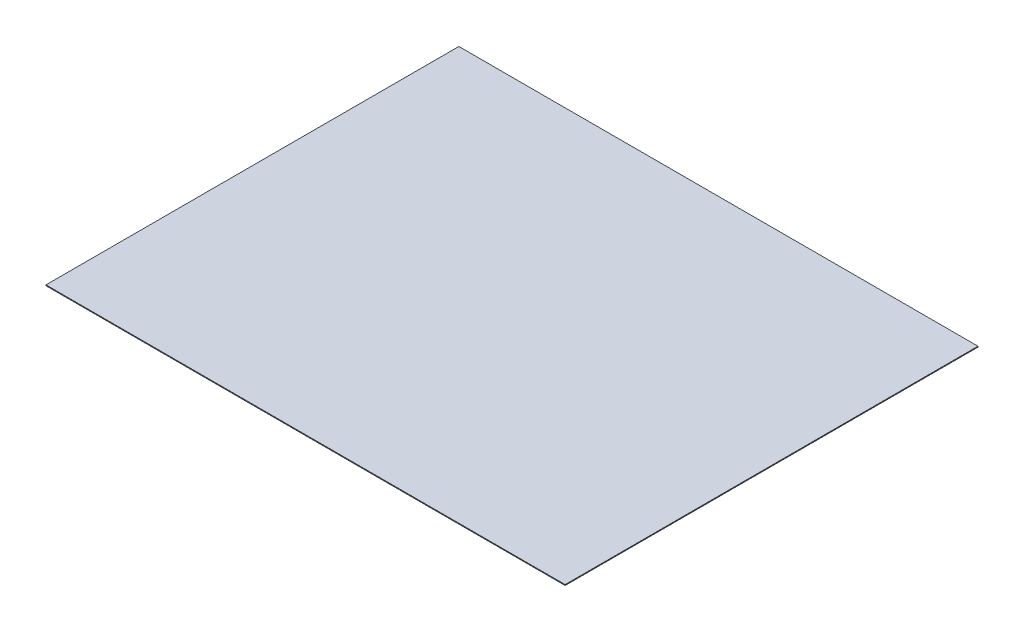
ISO-10303-21;
HEADER;
FILE_DESCRIPTION(('STEP AP214'),'2;1');
FILE_NAME('part.step','',(''),(''),'','','');
FILE_SCHEMA(('AUTOMOTIVE_DESIGN { 1 0 10303 214 1 1 1 1 }'));
ENDSEC;
DATA;
#1=APPLICATION_CONTEXT('core data for automotive mechanical design processes');
#2=APPLICATION_PROTOCOL_DEFINITION('international standard','automotive_design',2000,#1);
#3=PRODUCT_CONTEXT('',#1,'mechanical');
#4=PRODUCT('Part','Part','',(#3));
#5=PRODUCT_RELATED_PRODUCT_CATEGORY('part','',(#4));
#6=PRODUCT_DEFINITION_FORMATION('','',#4);
#7=PRODUCT_DEFINITION_CONTEXT('part definition',#1,'design');
#8=PRODUCT_DEFINITION('design','',#6,#7);
#9=PRODUCT_DEFINITION_SHAPE('','',#8);
#10=(LENGTH_UNIT() NAMED_UNIT(*) SI_UNIT(.MILLI.,.METRE.));
#11=(NAMED_UNIT(*) PLANE_ANGLE_UNIT() SI_UNIT($,.RADIAN.));
#12=(NAMED_UNIT(*) SI_UNIT($,.STERADIAN.) SOLID_ANGLE_UNIT());
#13=UNCERTAINTY_MEASURE_WITH_UNIT(LENGTH_MEASURE(1.E-05),#10,'distance_accuracy_value','');
#14=(GEOMETRIC_REPRESENTATION_CONTEXT(3) GLOBAL_UNCERTAINTY_ASSIGNED_CONTEXT((#13)) GLOBAL_UNIT_ASSIGNED_CONTEXT((#10,
#11,#12)) REPRESENTATION_CONTEXT('',''));
#15=CARTESIAN_POINT('',(0.,0.,0.));
#16=DIRECTION('',(0.,0.,1.));
#17=DIRECTION('',(1.,0.,0.));
#18=AXIS2_PLACEMENT_3D('',#15,#16,#17);
#19=CARTESIAN_POINT('',(0.,0.2,0.));
#20=DIRECTION('',(1.,0.,0.));
#21=DIRECTION('',(0.,0.,-1.));
#22=AXIS2_PLACEMENT_3D('',#19,#20,#21);
#23=PLANE('',#22);
#24=DIRECTION('',(0.,0.,1.));
#25=VECTOR('',#24,1.);
#26=CARTESIAN_POINT('',(0.,0.,0.));
#27=LINE('',#26,#25);
#28=CARTESIAN_POINT('',(0.,0.,0.));
#29=VERTEX_POINT('',#28);
#30=CARTESIAN_POINT('',(0.,0.,101.));
#31=VERTEX_POINT('',#30);
#32=EDGE_CURVE('E101',#29,#31,#27,.T.);
#33=ORIENTED_EDGE('',*,*,#32,.T.);
#34=DIRECTION('',(0.,-1.,0.));
#35=VECTOR('',#34,1.);
#36=CARTESIAN_POINT('',(0.,0.2,101.));
#37=LINE('',#36,#35);
#38=CARTESIAN_POINT('',(0.,0.2,101.));
#39=VERTEX_POINT('',#38);
#40=EDGE_CURVE('E11',#39,#31,#37,.T.);
#41=ORIENTED_EDGE('',*,*,#40,.F.);
#42=DIRECTION('',(0.,0.,1.));
#43=VECTOR('',#42,1.);
#44=CARTESIAN_POINT('',(0.,0.2,0.));
#45=LINE('',#44,#43);
#46=CARTESIAN_POINT('',(0.,0.2,0.));
#47=VERTEX_POINT('',#46);
#48=EDGE_CURVE('E89',#47,#39,#45,.T.);
#49=ORIENTED_EDGE('',*,*,#48,.F.);
#50=DIRECTION('',(0.,-1.,0.));
#51=VECTOR('',#50,1.);
#52=CARTESIAN_POINT('',(0.,0.2,0.));
#53=LINE('',#52,#51);
#54=EDGE_CURVE('E97',#47,#29,#53,.T.);
#55=ORIENTED_EDGE('',*,*,#54,.T.);
#56=EDGE_LOOP('',(#33,#41,#49,#55));
#57=FACE_BOUND('',#56,.T.);
#58=ADVANCED_FACE('F38',(#57),#23,.F.);
#59=CARTESIAN_POINT('',(0.,0.2,101.));
#60=DIRECTION('',(0.,0.,-1.));
#61=DIRECTION('',(-1.,0.,0.));
#62=AXIS2_PLACEMENT_3D('',#59,#60,#61);
#63=PLANE('',#62);
#64=DIRECTION('',(1.,0.,0.));
#65=VECTOR('',#64,1.);
#66=CARTESIAN_POINT('',(0.,0.,101.));
#67=LINE('',#66,#65);
#68=CARTESIAN_POINT('',(127.,0.,101.));
#69=VERTEX_POINT('',#68);
#70=EDGE_CURVE('E93',#31,#69,#67,.T.);
#71=ORIENTED_EDGE('',*,*,#70,.T.);
#72=DIRECTION('',(0.,-1.,0.));
#73=VECTOR('',#72,1.);
#74=CARTESIAN_POINT('',(127.,0.2,101.));
#75=LINE('',#74,#73);
#76=CARTESIAN_POINT('',(127.,0.2,101.));
#77=VERTEX_POINT('',#76);
#78=EDGE_CURVE('E46',#77,#69,#75,.T.);
#79=ORIENTED_EDGE('',*,*,#78,.F.);
#80=DIRECTION('',(1.,0.,0.));
#81=VECTOR('',#80,1.);
#82=CARTESIAN_POINT('',(0.,0.2,101.));
#83=LINE('',#82,#81);
#84=EDGE_CURVE('E84',#39,#77,#83,.T.);
#85=ORIENTED_EDGE('',*,*,#84,.F.);
#86=ORIENTED_EDGE('',*,*,#40,.T.);
#87=EDGE_LOOP('',(#71,#79,#85,#86));
#88=FACE_BOUND('',#87,.T.);
#89=ADVANCED_FACE('F92',(#88),#63,.F.);
#90=CARTESIAN_POINT('',(127.,0.2,0.));
#91=DIRECTION('',(-1.,0.,0.));
#92=DIRECTION('',(0.,0.,1.));
#93=AXIS2_PLACEMENT_3D('',#90,#91,#92);
#94=PLANE('',#93);
#95=DIRECTION('',(0.,0.,-1.));
#96=VECTOR('',#95,1.);
#97=CARTESIAN_POINT('',(127.,0.,0.));
#98=LINE('',#97,#96);
#99=CARTESIAN_POINT('',(127.,0.,0.));
#100=VERTEX_POINT('',#99);
#101=EDGE_CURVE('E71',#69,#100,#98,.T.);
#102=ORIENTED_EDGE('',*,*,#101,.T.);
#103=DIRECTION('',(0.,-1.,0.));
#104=VECTOR('',#103,1.);
#105=CARTESIAN_POINT('',(127.,0.2,0.));
#106=LINE('',#105,#104);
#107=CARTESIAN_POINT('',(127.,0.2,0.));
#108=VERTEX_POINT('',#107);
#109=EDGE_CURVE('E94',#108,#100,#106,.T.);
#110=ORIENTED_EDGE('',*,*,#109,.F.);
#111=DIRECTION('',(0.,0.,-1.));
#112=VECTOR('',#111,1.);
#113=CARTESIAN_POINT('',(127.,0.2,0.));
#114=LINE('',#113,#112);
#115=EDGE_CURVE('E87',#77,#108,#114,.T.);
#116=ORIENTED_EDGE('',*,*,#115,.F.);
#117=ORIENTED_EDGE('',*,*,#78,.T.);
#118=EDGE_LOOP('',(#102,#110,#116,#117));
#119=FACE_BOUND('',#118,.T.);
#120=ADVANCED_FACE('F95',(#119),#94,.F.);
#121=CARTESIAN_POINT('',(0.,0.2,0.));
#122=DIRECTION('',(0.,0.,1.));
#123=DIRECTION('',(1.,0.,0.));
#124=AXIS2_PLACEMENT_3D('',#121,#122,#123);
#125=PLANE('',#124);
#126=DIRECTION('',(-1.,0.,0.));
#127=VECTOR('',#126,1.);
#128=CARTESIAN_POINT('',(0.,0.,0.));
#129=LINE('',#128,#127);
#130=EDGE_CURVE('E77',#100,#29,#129,.T.);
#131=ORIENTED_EDGE('',*,*,#130,.T.);
#132=ORIENTED_EDGE('',*,*,#54,.F.);
#133=DIRECTION('',(-1.,0.,0.));
#134=VECTOR('',#133,1.);
#135=CARTESIAN_POINT('',(0.,0.2,0.));
#136=LINE('',#135,#134);
#137=EDGE_CURVE('E54',#108,#47,#136,.T.);
#138=ORIENTED_EDGE('',*,*,#137,.F.);
#139=ORIENTED_EDGE('',*,*,#109,.T.);
#140=EDGE_LOOP('',(#131,#132,#138,#139));
#141=FACE_BOUND('',#140,.T.);
#142=ADVANCED_FACE('F108',(#141),#125,.F.);
#143=CARTESIAN_POINT('',(0.,0.2,0.));
#144=DIRECTION('',(0.,1.,0.));
#145=DIRECTION('',(0.,0.,1.));
#146=AXIS2_PLACEMENT_3D('',#143,#144,#145);
#147=PLANE('',#146);
#148=ORIENTED_EDGE('',*,*,#48,.T.);
#149=ORIENTED_EDGE('',*,*,#84,.T.);
#150=ORIENTED_EDGE('',*,*,#115,.T.);
#151=ORIENTED_EDGE('',*,*,#137,.T.);
#152=EDGE_LOOP('',(#148,#149,#150,#151));
#153=FACE_BOUND('',#152,.T.);
#154=ADVANCED_FACE('F85',(#153),#147,.T.);
#155=CARTESIAN_POINT('',(0.,0.,0.));
#156=DIRECTION('',(0.,1.,0.));
#157=DIRECTION('',(0.,0.,1.));
#158=AXIS2_PLACEMENT_3D('',#155,#156,#157);
#159=PLANE('',#158);
#160=ORIENTED_EDGE('',*,*,#32,.F.);
#161=ORIENTED_EDGE('',*,*,#130,.F.);
#162=ORIENTED_EDGE('',*,*,#101,.F.);
#163=ORIENTED_EDGE('',*,*,#70,.F.);
#164=EDGE_LOOP('',(#160,#161,#162,#163));
#165=FACE_BOUND('',#164,.T.);
#166=ADVANCED_FACE('F111',(#165),#159,.F.);
#167=CLOSED_SHELL('',(#58,#89,#120,#142,#154,#166));
#168=MANIFOLD_SOLID_BREP('B2',#167);
#169=ADVANCED_BREP_SHAPE_REPRESENTATION('',(#18,#168),#14);
#170=SHAPE_DEFINITION_REPRESENTATION(#9,#169);
ENDSEC;
END-ISO-10303-21;
